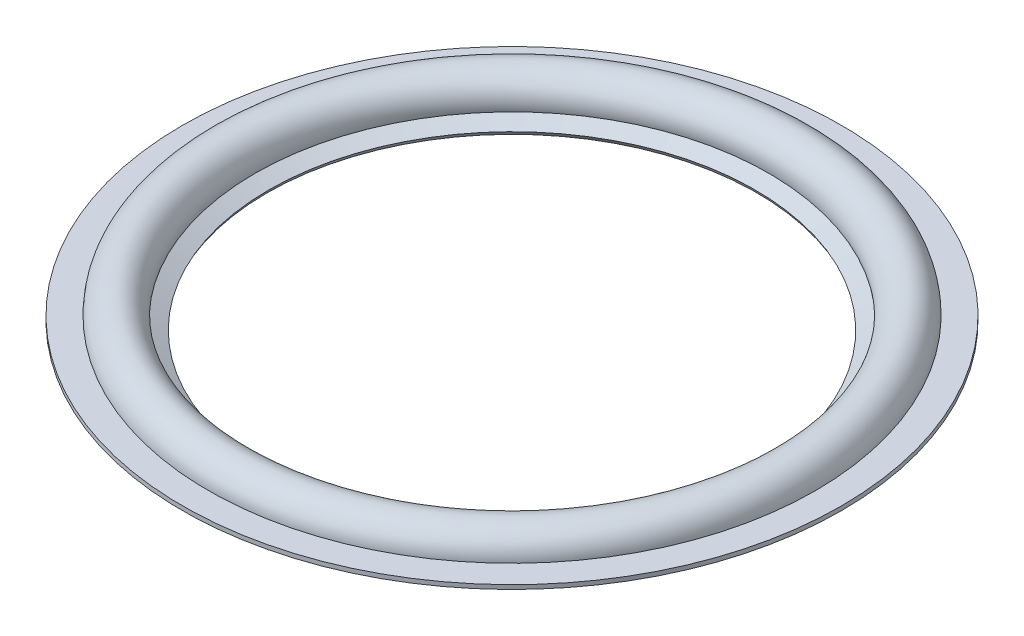
ISO-10303-21;
HEADER;
FILE_DESCRIPTION(('STEP AP214'),'2;1');
FILE_NAME('part.step','',(''),(''),'','','');
FILE_SCHEMA(('AUTOMOTIVE_DESIGN { 1 0 10303 214 1 1 1 1 }'));
ENDSEC;
DATA;
#1=APPLICATION_CONTEXT('core data for automotive mechanical design processes');
#2=APPLICATION_PROTOCOL_DEFINITION('international standard','automotive_design',2000,#1);
#3=PRODUCT_CONTEXT('',#1,'mechanical');
#4=PRODUCT('Part','Part','',(#3));
#5=PRODUCT_RELATED_PRODUCT_CATEGORY('part','',(#4));
#6=PRODUCT_DEFINITION_FORMATION('','',#4);
#7=PRODUCT_DEFINITION_CONTEXT('part definition',#1,'design');
#8=PRODUCT_DEFINITION('design','',#6,#7);
#9=PRODUCT_DEFINITION_SHAPE('','',#8);
#10=(LENGTH_UNIT() NAMED_UNIT(*) SI_UNIT(.MILLI.,.METRE.));
#11=(NAMED_UNIT(*) PLANE_ANGLE_UNIT() SI_UNIT($,.RADIAN.));
#12=(NAMED_UNIT(*) SI_UNIT($,.STERADIAN.) SOLID_ANGLE_UNIT());
#13=UNCERTAINTY_MEASURE_WITH_UNIT(LENGTH_MEASURE(1.E-05),#10,'distance_accuracy_value','');
#14=(GEOMETRIC_REPRESENTATION_CONTEXT(3) GLOBAL_UNCERTAINTY_ASSIGNED_CONTEXT((#13)) GLOBAL_UNIT_ASSIGNED_CONTEXT((#10,
#11,#12)) REPRESENTATION_CONTEXT('',''));
#15=CARTESIAN_POINT('',(0.,0.,0.));
#16=DIRECTION('',(0.,0.,1.));
#17=DIRECTION('',(1.,0.,0.));
#18=AXIS2_PLACEMENT_3D('',#15,#16,#17);
#19=CARTESIAN_POINT('',(0.,0.,0.));
#20=DIRECTION('',(0.,1.,0.));
#21=DIRECTION('',(-1.,0.,0.));
#22=AXIS2_PLACEMENT_3D('',#19,#20,#21);
#23=CYLINDRICAL_SURFACE('',#22,63.);
#24=CARTESIAN_POINT('',(0.,-0.799999999999992,0.));
#25=DIRECTION('',(0.,1.,0.));
#26=DIRECTION('',(-1.,0.,0.));
#27=AXIS2_PLACEMENT_3D('',#24,#25,#26);
#28=CIRCLE('',#27,63.);
#29=CARTESIAN_POINT('',(-63.,-0.8,0.));
#30=VERTEX_POINT('',#29);
#31=EDGE_CURVE('E68',#30,#30,#28,.T.);
#32=ORIENTED_EDGE('',*,*,#31,.T.);
#33=EDGE_LOOP('',(#32));
#34=FACE_BOUND('',#33,.T.);
#35=CARTESIAN_POINT('',(0.,0.,0.));
#36=DIRECTION('',(0.,1.,0.));
#37=DIRECTION('',(-1.,0.,0.));
#38=AXIS2_PLACEMENT_3D('',#35,#36,#37);
#39=CIRCLE('',#38,63.);
#40=CARTESIAN_POINT('',(-63.,0.,0.));
#41=VERTEX_POINT('',#40);
#42=EDGE_CURVE('E53',#41,#41,#39,.T.);
#43=ORIENTED_EDGE('',*,*,#42,.F.);
#44=EDGE_LOOP('',(#43));
#45=FACE_BOUND('',#44,.T.);
#46=ADVANCED_FACE('F33',(#34,#45),#23,.T.);
#47=CARTESIAN_POINT('',(-63.,0.,0.));
#48=DIRECTION('',(0.,1.,0.));
#49=DIRECTION('',(-1.,0.,0.));
#50=AXIS2_PLACEMENT_3D('',#47,#48,#49);
#51=PLANE('',#50);
#52=ORIENTED_EDGE('',*,*,#42,.T.);
#53=EDGE_LOOP('',(#52));
#54=FACE_BOUND('',#53,.T.);
#55=CARTESIAN_POINT('',(0.,0.,0.));
#56=DIRECTION('',(0.,1.,0.));
#57=DIRECTION('',(-1.,0.,0.));
#58=AXIS2_PLACEMENT_3D('',#55,#56,#57);
#59=CIRCLE('',#58,58.);
#60=CARTESIAN_POINT('',(-58.,0.,0.));
#61=VERTEX_POINT('',#60);
#62=EDGE_CURVE('E56',#61,#61,#59,.T.);
#63=ORIENTED_EDGE('',*,*,#62,.F.);
#64=EDGE_LOOP('',(#63));
#65=FACE_BOUND('',#64,.T.);
#66=ADVANCED_FACE('F88',(#54,#65),#51,.T.);
#67=CARTESIAN_POINT('',(0.,0.,0.));
#68=DIRECTION('',(0.,1.,0.));
#69=DIRECTION('',(-1.,0.,0.));
#70=AXIS2_PLACEMENT_3D('',#67,#68,#69);
#71=TOROIDAL_SURFACE('',#70,53.5,4.5);
#72=ORIENTED_EDGE('',*,*,#62,.T.);
#73=EDGE_LOOP('',(#72));
#74=FACE_BOUND('',#73,.T.);
#75=CARTESIAN_POINT('',(0.,-0.999999999999992,0.));
#76=DIRECTION('',(0.,1.,0.));
#77=DIRECTION('',(-1.,0.,0.));
#78=AXIS2_PLACEMENT_3D('',#75,#76,#77);
#79=CIRCLE('',#78,49.1125178063039);
#80=CARTESIAN_POINT('',(-49.1125178063039,-0.999999999999999,0.));
#81=VERTEX_POINT('',#80);
#82=EDGE_CURVE('E59',#81,#81,#79,.T.);
#83=ORIENTED_EDGE('',*,*,#82,.F.);
#84=EDGE_LOOP('',(#83));
#85=FACE_BOUND('',#84,.T.);
#86=ADVANCED_FACE('F93',(#74,#85),#71,.T.);
#87=CARTESIAN_POINT('',(0.,-2.40841468835767,0.));
#88=DIRECTION('',(0.,1.,0.));
#89=DIRECTION('',(-1.,0.,0.));
#90=AXIS2_PLACEMENT_3D('',#87,#88,#89);
#91=CONICAL_SURFACE('',#90,46.4636750277272,1.08210413623648);
#92=ORIENTED_EDGE('',*,*,#82,.T.);
#93=EDGE_LOOP('',(#92));
#94=FACE_BOUND('',#93,.T.);
#95=CARTESIAN_POINT('',(0.,-2.40841468835767,0.));
#96=DIRECTION('',(0.,1.,0.));
#97=DIRECTION('',(-1.,0.,0.));
#98=AXIS2_PLACEMENT_3D('',#95,#96,#97);
#99=CIRCLE('',#98,46.4636750277272);
#100=CARTESIAN_POINT('',(-46.4636750277272,-2.40841468835768,0.));
#101=VERTEX_POINT('',#100);
#102=EDGE_CURVE('E62',#101,#101,#99,.T.);
#103=ORIENTED_EDGE('',*,*,#102,.F.);
#104=EDGE_LOOP('',(#103));
#105=FACE_BOUND('',#104,.T.);
#106=ADVANCED_FACE('F99',(#94,#105),#91,.F.);
#107=CARTESIAN_POINT('',(0.,-3.11477276264481,0.));
#108=DIRECTION('',(0.,-1.,0.));
#109=DIRECTION('',(1.,0.,0.));
#110=AXIS2_PLACEMENT_3D('',#107,#108,#109);
#111=CONICAL_SURFACE('',#110,46.8392522779559,0.488692190558417);
#112=ORIENTED_EDGE('',*,*,#102,.T.);
#113=EDGE_LOOP('',(#112));
#114=FACE_BOUND('',#113,.T.);
#115=CARTESIAN_POINT('',(0.,-3.11477276264481,0.));
#116=DIRECTION('',(0.,1.,0.));
#117=DIRECTION('',(-1.,0.,0.));
#118=AXIS2_PLACEMENT_3D('',#115,#116,#117);
#119=CIRCLE('',#118,46.8392522779559);
#120=CARTESIAN_POINT('',(-46.8392522779559,-3.11477276264482,0.));
#121=VERTEX_POINT('',#120);
#122=EDGE_CURVE('E65',#121,#121,#119,.T.);
#123=ORIENTED_EDGE('',*,*,#122,.F.);
#124=EDGE_LOOP('',(#123));
#125=FACE_BOUND('',#124,.T.);
#126=ADVANCED_FACE('F103',(#114,#125),#111,.F.);
#127=CARTESIAN_POINT('',(0.,-1.39527221215403,0.));
#128=DIRECTION('',(0.,1.,0.));
#129=DIRECTION('',(-1.,0.,0.));
#130=AXIS2_PLACEMENT_3D('',#127,#128,#129);
#131=CONICAL_SURFACE('',#130,50.0731624704415,1.08210413623648);
#132=CARTESIAN_POINT('',(0.,-1.59559099686877,0.));
#133=DIRECTION('',(0.,-1.,0.));
#134=DIRECTION('',(1.,0.,0.));
#135=AXIS2_PLACEMENT_3D('',#132,#133,#134);
#136=CIRCLE('',#135,49.6964176305225);
#137=CARTESIAN_POINT('',(49.6964176305225,-1.59559099686876,0.));
#138=VERTEX_POINT('',#137);
#139=EDGE_CURVE('E40',#138,#138,#136,.T.);
#140=ORIENTED_EDGE('',*,*,#139,.T.);
#141=EDGE_LOOP('',(#140));
#142=FACE_BOUND('',#141,.T.);
#143=ORIENTED_EDGE('',*,*,#122,.T.);
#144=EDGE_LOOP('',(#143));
#145=FACE_BOUND('',#144,.T.);
#146=ADVANCED_FACE('F84',(#142,#145),#131,.T.);
#147=CARTESIAN_POINT('',(0.,0.,0.));
#148=DIRECTION('',(0.,1.,0.));
#149=DIRECTION('',(-1.,0.,0.));
#150=AXIS2_PLACEMENT_3D('',#147,#148,#149);
#151=TOROIDAL_SURFACE('',#150,53.5,3.7);
#152=CARTESIAN_POINT('',(0.,-1.01672229562509,0.));
#153=DIRECTION('',(0.,1.,0.));
#154=DIRECTION('',(-1.,0.,0.));
#155=AXIS2_PLACEMENT_3D('',#152,#153,#154);
#156=CIRCLE('',#155,49.9424340099474);
#157=CARTESIAN_POINT('',(-49.9424340099474,-1.0167222956251,0.));
#158=VERTEX_POINT('',#157);
#159=EDGE_CURVE('E44',#158,#158,#156,.T.);
#160=ORIENTED_EDGE('',*,*,#159,.T.);
#161=EDGE_LOOP('',(#160));
#162=FACE_BOUND('',#161,.T.);
#163=CARTESIAN_POINT('',(0.,-0.264285714285707,0.));
#164=DIRECTION('',(0.,1.,0.));
#165=DIRECTION('',(-1.,0.,0.));
#166=AXIS2_PLACEMENT_3D('',#163,#164,#165);
#167=CIRCLE('',#166,57.1905491544247);
#168=CARTESIAN_POINT('',(-57.1905491544247,-0.264285714285714,0.));
#169=VERTEX_POINT('',#168);
#170=EDGE_CURVE('E48',#169,#169,#167,.F.);
#171=ORIENTED_EDGE('',*,*,#170,.T.);
#172=EDGE_LOOP('',(#171));
#173=FACE_BOUND('',#172,.T.);
#174=ADVANCED_FACE('F77',(#162,#173),#151,.F.);
#175=CARTESIAN_POINT('',(-63.,-0.8,0.));
#176=DIRECTION('',(0.,-1.,0.));
#177=DIRECTION('',(1.,0.,0.));
#178=AXIS2_PLACEMENT_3D('',#175,#176,#177);
#179=PLANE('',#178);
#180=CARTESIAN_POINT('',(0.,-0.799999999999992,0.));
#181=DIRECTION('',(0.,-1.,0.));
#182=DIRECTION('',(1.,0.,0.));
#183=AXIS2_PLACEMENT_3D('',#180,#181,#182);
#184=CIRCLE('',#183,57.6892720131307);
#185=CARTESIAN_POINT('',(57.6892720131307,-0.799999999999985,0.));
#186=VERTEX_POINT('',#185);
#187=EDGE_CURVE('E10',#186,#186,#184,.F.);
#188=ORIENTED_EDGE('',*,*,#187,.T.);
#189=EDGE_LOOP('',(#188));
#190=FACE_BOUND('',#189,.T.);
#191=ORIENTED_EDGE('',*,*,#31,.F.);
#192=EDGE_LOOP('',(#191));
#193=FACE_BOUND('',#192,.T.);
#194=ADVANCED_FACE('F74',(#190,#193),#179,.T.);
#195=CARTESIAN_POINT('',(0.,-1.1541172004393,0.));
#196=DIRECTION('',(0.,-1.,0.));
#197=DIRECTION('',(1.,0.,0.));
#198=AXIS2_PLACEMENT_3D('',#195,#196,#197);
#199=TOROIDAL_SURFACE('',#198,49.4616818491295,0.5);
#200=ORIENTED_EDGE('',*,*,#139,.F.);
#201=EDGE_LOOP('',(#200));
#202=FACE_BOUND('',#201,.T.);
#203=ORIENTED_EDGE('',*,*,#159,.F.);
#204=EDGE_LOOP('',(#203));
#205=FACE_BOUND('',#204,.T.);
#206=ADVANCED_FACE('F76',(#202,#205),#199,.T.);
#207=CARTESIAN_POINT('',(0.,-0.299999999999992,0.));
#208=DIRECTION('',(0.,-1.,0.));
#209=DIRECTION('',(1.,0.,0.));
#210=AXIS2_PLACEMENT_3D('',#207,#208,#209);
#211=TOROIDAL_SURFACE('',#210,57.6892720131307,0.5);
#212=ORIENTED_EDGE('',*,*,#170,.F.);
#213=EDGE_LOOP('',(#212));
#214=FACE_BOUND('',#213,.T.);
#215=ORIENTED_EDGE('',*,*,#187,.F.);
#216=EDGE_LOOP('',(#215));
#217=FACE_BOUND('',#216,.T.);
#218=ADVANCED_FACE('F35',(#214,#217),#211,.T.);
#219=CLOSED_SHELL('',(#46,#66,#86,#106,#126,#146,#174,#194,#206,#218));
#220=MANIFOLD_SOLID_BREP('B2',#219);
#221=ADVANCED_BREP_SHAPE_REPRESENTATION('',(#18,#220),#14);
#222=SHAPE_DEFINITION_REPRESENTATION(#9,#221);
ENDSEC;
END-ISO-10303-21;
